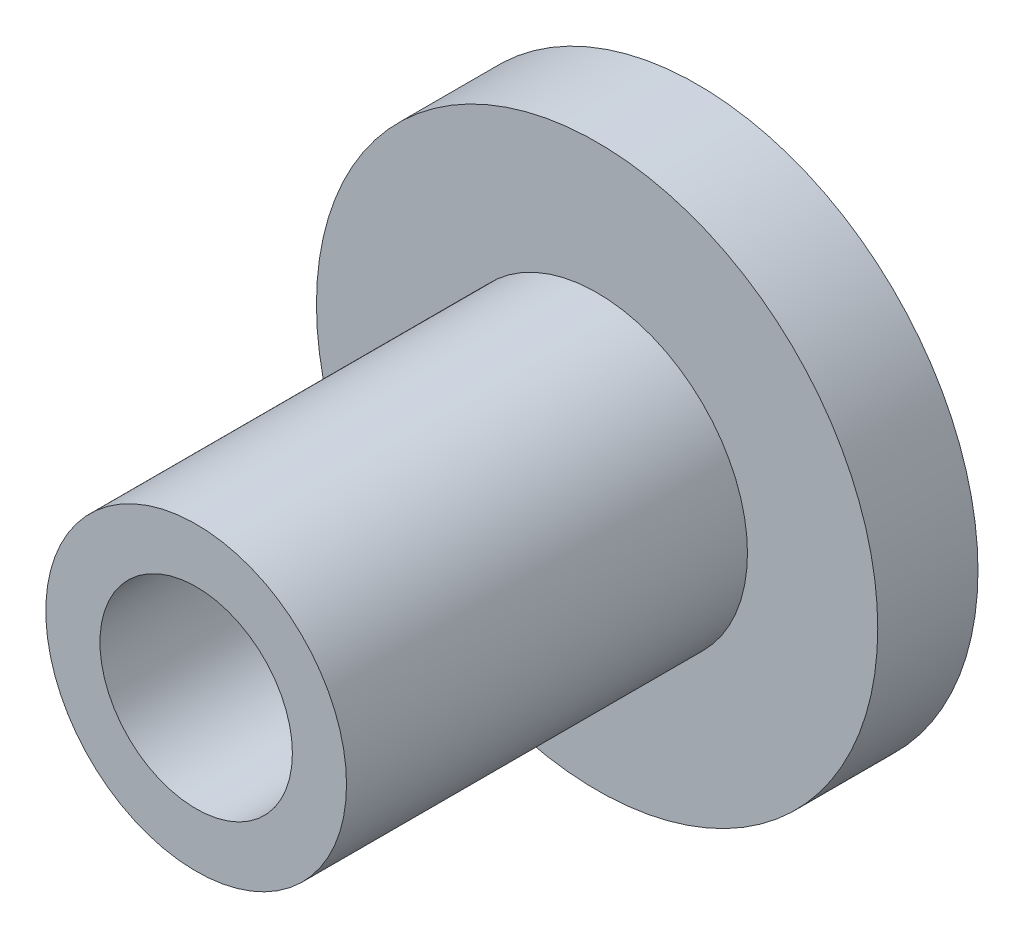
ISO-10303-21;
HEADER;
FILE_DESCRIPTION(('STEP AP214'),'2;1');
FILE_NAME('part.step','',(''),(''),'','','');
FILE_SCHEMA(('AUTOMOTIVE_DESIGN { 1 0 10303 214 1 1 1 1 }'));
ENDSEC;
DATA;
#1=APPLICATION_CONTEXT('core data for automotive mechanical design processes');
#2=APPLICATION_PROTOCOL_DEFINITION('international standard','automotive_design',2000,#1);
#3=PRODUCT_CONTEXT('',#1,'mechanical');
#4=PRODUCT('Part','Part','',(#3));
#5=PRODUCT_RELATED_PRODUCT_CATEGORY('part','',(#4));
#6=PRODUCT_DEFINITION_FORMATION('','',#4);
#7=PRODUCT_DEFINITION_CONTEXT('part definition',#1,'design');
#8=PRODUCT_DEFINITION('design','',#6,#7);
#9=PRODUCT_DEFINITION_SHAPE('','',#8);
#10=(LENGTH_UNIT() NAMED_UNIT(*) SI_UNIT(.MILLI.,.METRE.));
#11=(NAMED_UNIT(*) PLANE_ANGLE_UNIT() SI_UNIT($,.RADIAN.));
#12=(NAMED_UNIT(*) SI_UNIT($,.STERADIAN.) SOLID_ANGLE_UNIT());
#13=UNCERTAINTY_MEASURE_WITH_UNIT(LENGTH_MEASURE(1.E-05),#10,'distance_accuracy_value','');
#14=(GEOMETRIC_REPRESENTATION_CONTEXT(3) GLOBAL_UNCERTAINTY_ASSIGNED_CONTEXT((#13)) GLOBAL_UNIT_ASSIGNED_CONTEXT((#10,
#11,#12)) REPRESENTATION_CONTEXT('',''));
#15=CARTESIAN_POINT('',(0.,0.,0.));
#16=DIRECTION('',(0.,0.,1.));
#17=DIRECTION('',(1.,0.,0.));
#18=AXIS2_PLACEMENT_3D('',#15,#16,#17);
#19=CARTESIAN_POINT('',(0.,0.,2.5));
#20=DIRECTION('',(0.,0.,-1.));
#21=DIRECTION('',(-1.,0.,0.));
#22=AXIS2_PLACEMENT_3D('',#19,#20,#21);
#23=CYLINDRICAL_SURFACE('',#22,7.);
#24=CARTESIAN_POINT('',(0.,0.,2.5));
#25=DIRECTION('',(0.,0.,1.));
#26=DIRECTION('',(1.,0.,0.));
#27=AXIS2_PLACEMENT_3D('',#24,#25,#26);
#28=CIRCLE('',#27,7.);
#29=CARTESIAN_POINT('',(7.,0.,2.5));
#30=VERTEX_POINT('',#29);
#31=EDGE_CURVE('E45',#30,#30,#28,.T.);
#32=ORIENTED_EDGE('',*,*,#31,.F.);
#33=EDGE_LOOP('',(#32));
#34=FACE_BOUND('',#33,.T.);
#35=CARTESIAN_POINT('',(0.,0.,0.));
#36=DIRECTION('',(0.,0.,1.));
#37=DIRECTION('',(1.,0.,0.));
#38=AXIS2_PLACEMENT_3D('',#35,#36,#37);
#39=CIRCLE('',#38,7.);
#40=CARTESIAN_POINT('',(7.,0.,0.));
#41=VERTEX_POINT('',#40);
#42=EDGE_CURVE('E40',#41,#41,#39,.T.);
#43=ORIENTED_EDGE('',*,*,#42,.T.);
#44=EDGE_LOOP('',(#43));
#45=FACE_BOUND('',#44,.T.);
#46=ADVANCED_FACE('F37',(#34,#45),#23,.T.);
#47=CARTESIAN_POINT('',(0.,0.,2.5));
#48=DIRECTION('',(0.,0.,1.));
#49=DIRECTION('',(1.,0.,0.));
#50=AXIS2_PLACEMENT_3D('',#47,#48,#49);
#51=PLANE('',#50);
#52=CARTESIAN_POINT('',(0.,0.,2.5));
#53=DIRECTION('',(0.,0.,1.));
#54=DIRECTION('',(1.,0.,0.));
#55=AXIS2_PLACEMENT_3D('',#52,#53,#54);
#56=CIRCLE('',#55,3.75);
#57=CARTESIAN_POINT('',(3.75,0.,2.5));
#58=VERTEX_POINT('',#57);
#59=EDGE_CURVE('E10',#58,#58,#56,.T.);
#60=ORIENTED_EDGE('',*,*,#59,.F.);
#61=EDGE_LOOP('',(#60));
#62=FACE_BOUND('',#61,.T.);
#63=ORIENTED_EDGE('',*,*,#31,.T.);
#64=EDGE_LOOP('',(#63));
#65=FACE_BOUND('',#64,.T.);
#66=ADVANCED_FACE('F86',(#62,#65),#51,.T.);
#67=CARTESIAN_POINT('',(0.,0.,0.));
#68=DIRECTION('',(0.,0.,1.));
#69=DIRECTION('',(1.,0.,0.));
#70=AXIS2_PLACEMENT_3D('',#67,#68,#69);
#71=PLANE('',#70);
#72=ORIENTED_EDGE('',*,*,#42,.F.);
#73=EDGE_LOOP('',(#72));
#74=FACE_BOUND('',#73,.T.);
#75=ADVANCED_FACE('F81',(#74),#71,.F.);
#76=CARTESIAN_POINT('',(0.,0.,12.5));
#77=DIRECTION('',(0.,0.,-1.));
#78=DIRECTION('',(-1.,0.,0.));
#79=AXIS2_PLACEMENT_3D('',#76,#77,#78);
#80=CYLINDRICAL_SURFACE('',#79,3.75);
#81=CARTESIAN_POINT('',(0.,0.,12.5));
#82=DIRECTION('',(0.,0.,1.));
#83=DIRECTION('',(1.,0.,0.));
#84=AXIS2_PLACEMENT_3D('',#81,#82,#83);
#85=CIRCLE('',#84,3.75);
#86=CARTESIAN_POINT('',(3.75,0.,12.5));
#87=VERTEX_POINT('',#86);
#88=EDGE_CURVE('E52',#87,#87,#85,.T.);
#89=ORIENTED_EDGE('',*,*,#88,.F.);
#90=EDGE_LOOP('',(#89));
#91=FACE_BOUND('',#90,.T.);
#92=ORIENTED_EDGE('',*,*,#59,.T.);
#93=EDGE_LOOP('',(#92));
#94=FACE_BOUND('',#93,.T.);
#95=ADVANCED_FACE('F76',(#91,#94),#80,.T.);
#96=CARTESIAN_POINT('',(0.,0.,12.5));
#97=DIRECTION('',(0.,0.,1.));
#98=DIRECTION('',(1.,0.,0.));
#99=AXIS2_PLACEMENT_3D('',#96,#97,#98);
#100=PLANE('',#99);
#101=CARTESIAN_POINT('',(0.,0.,12.5));
#102=DIRECTION('',(0.,0.,1.));
#103=DIRECTION('',(1.,0.,0.));
#104=AXIS2_PLACEMENT_3D('',#101,#102,#103);
#105=CIRCLE('',#104,2.4);
#106=CARTESIAN_POINT('',(2.4,0.,12.5));
#107=VERTEX_POINT('',#106);
#108=EDGE_CURVE('E57',#107,#107,#105,.T.);
#109=ORIENTED_EDGE('',*,*,#108,.F.);
#110=EDGE_LOOP('',(#109));
#111=FACE_BOUND('',#110,.T.);
#112=ORIENTED_EDGE('',*,*,#88,.T.);
#113=EDGE_LOOP('',(#112));
#114=FACE_BOUND('',#113,.T.);
#115=ADVANCED_FACE('F70',(#111,#114),#100,.T.);
#116=CARTESIAN_POINT('',(0.,0.,7.5));
#117=DIRECTION('',(0.,0.,1.));
#118=DIRECTION('',(1.,0.,0.));
#119=AXIS2_PLACEMENT_3D('',#116,#117,#118);
#120=CYLINDRICAL_SURFACE('',#119,2.4);
#121=CARTESIAN_POINT('',(0.,0.,7.5));
#122=DIRECTION('',(0.,0.,1.));
#123=DIRECTION('',(1.,0.,0.));
#124=AXIS2_PLACEMENT_3D('',#121,#122,#123);
#125=CIRCLE('',#124,2.4);
#126=CARTESIAN_POINT('',(2.4,0.,7.5));
#127=VERTEX_POINT('',#126);
#128=EDGE_CURVE('E56',#127,#127,#125,.T.);
#129=ORIENTED_EDGE('',*,*,#128,.F.);
#130=EDGE_LOOP('',(#129));
#131=FACE_BOUND('',#130,.T.);
#132=ORIENTED_EDGE('',*,*,#108,.T.);
#133=EDGE_LOOP('',(#132));
#134=FACE_BOUND('',#133,.T.);
#135=ADVANCED_FACE('F67',(#131,#134),#120,.F.);
#136=CARTESIAN_POINT('',(0.,0.,7.5));
#137=DIRECTION('',(0.,0.,1.));
#138=DIRECTION('',(1.,0.,0.));
#139=AXIS2_PLACEMENT_3D('',#136,#137,#138);
#140=PLANE('',#139);
#141=ORIENTED_EDGE('',*,*,#128,.T.);
#142=EDGE_LOOP('',(#141));
#143=FACE_BOUND('',#142,.T.);
#144=ADVANCED_FACE('F65',(#143),#140,.T.);
#145=CLOSED_SHELL('',(#46,#66,#75,#95,#115,#135,#144));
#146=MANIFOLD_SOLID_BREP('B2',#145);
#147=ADVANCED_BREP_SHAPE_REPRESENTATION('',(#18,#146),#14);
#148=SHAPE_DEFINITION_REPRESENTATION(#9,#147);
ENDSEC;
END-ISO-10303-21;
